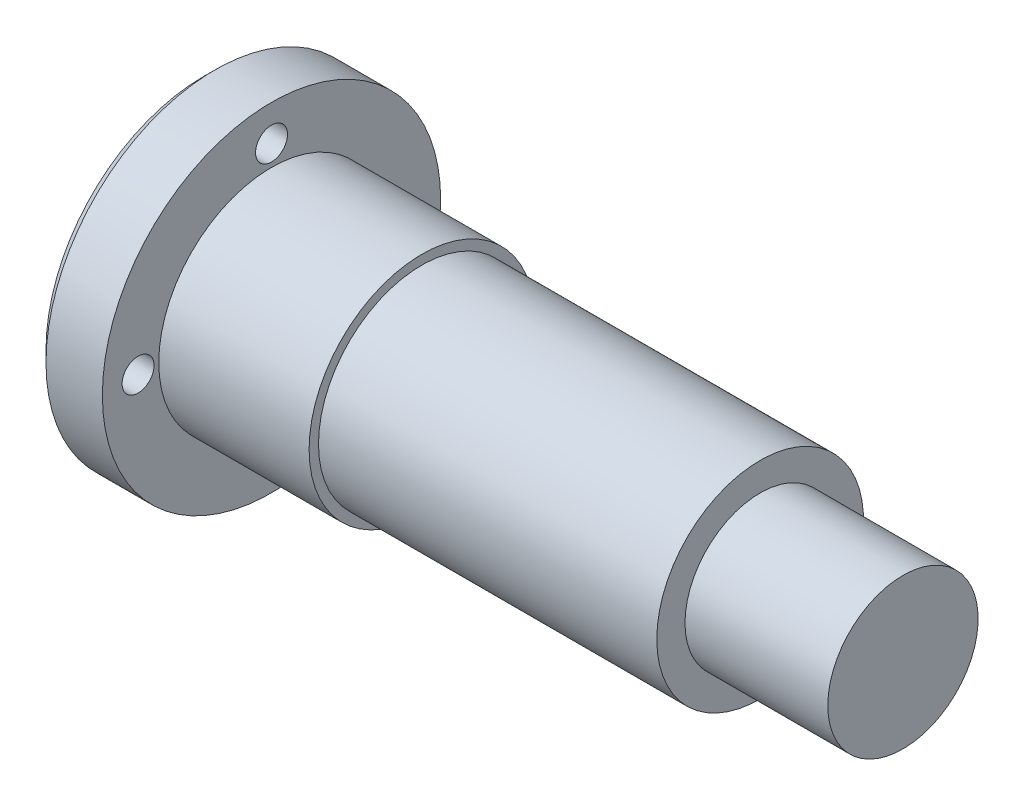
ISO-10303-21;
HEADER;
FILE_DESCRIPTION(('STEP AP214'),'2;1');
FILE_NAME('part.step','',(''),(''),'','','');
FILE_SCHEMA(('AUTOMOTIVE_DESIGN { 1 0 10303 214 1 1 1 1 }'));
ENDSEC;
DATA;
#1=APPLICATION_CONTEXT('core data for automotive mechanical design processes');
#2=APPLICATION_PROTOCOL_DEFINITION('international standard','automotive_design',2000,#1);
#3=PRODUCT_CONTEXT('',#1,'mechanical');
#4=PRODUCT('Part','Part','',(#3));
#5=PRODUCT_RELATED_PRODUCT_CATEGORY('part','',(#4));
#6=PRODUCT_DEFINITION_FORMATION('','',#4);
#7=PRODUCT_DEFINITION_CONTEXT('part definition',#1,'design');
#8=PRODUCT_DEFINITION('design','',#6,#7);
#9=PRODUCT_DEFINITION_SHAPE('','',#8);
#10=(LENGTH_UNIT() NAMED_UNIT(*) SI_UNIT(.MILLI.,.METRE.));
#11=(NAMED_UNIT(*) PLANE_ANGLE_UNIT() SI_UNIT($,.RADIAN.));
#12=(NAMED_UNIT(*) SI_UNIT($,.STERADIAN.) SOLID_ANGLE_UNIT());
#13=UNCERTAINTY_MEASURE_WITH_UNIT(LENGTH_MEASURE(1.E-05),#10,'distance_accuracy_value','');
#14=(GEOMETRIC_REPRESENTATION_CONTEXT(3) GLOBAL_UNCERTAINTY_ASSIGNED_CONTEXT((#13)) GLOBAL_UNIT_ASSIGNED_CONTEXT((#10,
#11,#12)) REPRESENTATION_CONTEXT('',''));
#15=CARTESIAN_POINT('',(0.,0.,0.));
#16=DIRECTION('',(0.,0.,1.));
#17=DIRECTION('',(1.,0.,0.));
#18=AXIS2_PLACEMENT_3D('',#15,#16,#17);
#19=CARTESIAN_POINT('',(189.,0.,0.));
#20=DIRECTION('',(-1.,0.,0.));
#21=DIRECTION('',(0.,0.,1.));
#22=AXIS2_PLACEMENT_3D('',#19,#20,#21);
#23=PLANE('',#22);
#24=CARTESIAN_POINT('',(189.,0.,0.));
#25=DIRECTION('',(-1.,0.,0.));
#26=DIRECTION('',(0.,0.,1.));
#27=AXIS2_PLACEMENT_3D('',#24,#25,#26);
#28=CIRCLE('',#27,20.);
#29=CARTESIAN_POINT('',(189.,0.,20.));
#30=VERTEX_POINT('',#29);
#31=EDGE_CURVE('E47',#30,#30,#28,.T.);
#32=ORIENTED_EDGE('',*,*,#31,.F.);
#33=EDGE_LOOP('',(#32));
#34=FACE_BOUND('',#33,.T.);
#35=ADVANCED_FACE('F35',(#34),#23,.F.);
#36=CARTESIAN_POINT('',(0.,0.,0.));
#37=DIRECTION('',(-1.,0.,0.));
#38=DIRECTION('',(0.,0.,1.));
#39=AXIS2_PLACEMENT_3D('',#36,#37,#38);
#40=CYLINDRICAL_SURFACE('',#39,20.);
#41=CARTESIAN_POINT('',(151.,0.,0.));
#42=DIRECTION('',(-1.,0.,0.));
#43=DIRECTION('',(0.,0.,1.));
#44=AXIS2_PLACEMENT_3D('',#41,#42,#43);
#45=CIRCLE('',#44,20.);
#46=CARTESIAN_POINT('',(151.,0.,20.));
#47=VERTEX_POINT('',#46);
#48=EDGE_CURVE('E51',#47,#47,#45,.T.);
#49=ORIENTED_EDGE('',*,*,#48,.F.);
#50=EDGE_LOOP('',(#49));
#51=FACE_BOUND('',#50,.T.);
#52=ORIENTED_EDGE('',*,*,#31,.T.);
#53=EDGE_LOOP('',(#52));
#54=FACE_BOUND('',#53,.T.);
#55=ADVANCED_FACE('F130',(#51,#54),#40,.T.);
#56=CARTESIAN_POINT('',(151.,20.,0.));
#57=DIRECTION('',(-1.,0.,0.));
#58=DIRECTION('',(0.,0.,1.));
#59=AXIS2_PLACEMENT_3D('',#56,#57,#58);
#60=PLANE('',#59);
#61=CARTESIAN_POINT('',(151.,0.,0.));
#62=DIRECTION('',(-1.,0.,0.));
#63=DIRECTION('',(0.,0.,1.));
#64=AXIS2_PLACEMENT_3D('',#61,#62,#63);
#65=CIRCLE('',#64,27.5);
#66=CARTESIAN_POINT('',(151.,0.,27.5));
#67=VERTEX_POINT('',#66);
#68=EDGE_CURVE('E56',#67,#67,#65,.T.);
#69=ORIENTED_EDGE('',*,*,#68,.F.);
#70=EDGE_LOOP('',(#69));
#71=FACE_BOUND('',#70,.T.);
#72=ORIENTED_EDGE('',*,*,#48,.T.);
#73=EDGE_LOOP('',(#72));
#74=FACE_BOUND('',#73,.T.);
#75=ADVANCED_FACE('F135',(#71,#74),#60,.F.);
#76=CARTESIAN_POINT('',(0.,0.,0.));
#77=DIRECTION('',(-1.,0.,0.));
#78=DIRECTION('',(0.,0.,1.));
#79=AXIS2_PLACEMENT_3D('',#76,#77,#78);
#80=CYLINDRICAL_SURFACE('',#79,27.5);
#81=CARTESIAN_POINT('',(61.,0.,0.));
#82=DIRECTION('',(-1.,0.,0.));
#83=DIRECTION('',(0.,0.,1.));
#84=AXIS2_PLACEMENT_3D('',#81,#82,#83);
#85=CIRCLE('',#84,27.5);
#86=CARTESIAN_POINT('',(61.,0.,27.5));
#87=VERTEX_POINT('',#86);
#88=EDGE_CURVE('E59',#87,#87,#85,.T.);
#89=ORIENTED_EDGE('',*,*,#88,.F.);
#90=EDGE_LOOP('',(#89));
#91=FACE_BOUND('',#90,.T.);
#92=ORIENTED_EDGE('',*,*,#68,.T.);
#93=EDGE_LOOP('',(#92));
#94=FACE_BOUND('',#93,.T.);
#95=ADVANCED_FACE('F142',(#91,#94),#80,.T.);
#96=CARTESIAN_POINT('',(61.,30.,0.));
#97=DIRECTION('',(-1.,0.,0.));
#98=DIRECTION('',(0.,0.,1.));
#99=AXIS2_PLACEMENT_3D('',#96,#97,#98);
#100=PLANE('',#99);
#101=CARTESIAN_POINT('',(61.,0.,0.));
#102=DIRECTION('',(-1.,0.,0.));
#103=DIRECTION('',(0.,0.,1.));
#104=AXIS2_PLACEMENT_3D('',#101,#102,#103);
#105=CIRCLE('',#104,30.);
#106=CARTESIAN_POINT('',(61.,0.,30.));
#107=VERTEX_POINT('',#106);
#108=EDGE_CURVE('E62',#107,#107,#105,.T.);
#109=ORIENTED_EDGE('',*,*,#108,.F.);
#110=EDGE_LOOP('',(#109));
#111=FACE_BOUND('',#110,.T.);
#112=ORIENTED_EDGE('',*,*,#88,.T.);
#113=EDGE_LOOP('',(#112));
#114=FACE_BOUND('',#113,.T.);
#115=ADVANCED_FACE('F146',(#111,#114),#100,.F.);
#116=CARTESIAN_POINT('',(0.,0.,0.));
#117=DIRECTION('',(-1.,0.,0.));
#118=DIRECTION('',(0.,0.,1.));
#119=AXIS2_PLACEMENT_3D('',#116,#117,#118);
#120=CYLINDRICAL_SURFACE('',#119,30.);
#121=CARTESIAN_POINT('',(21.,0.,0.));
#122=DIRECTION('',(-1.,0.,0.));
#123=DIRECTION('',(0.,0.,1.));
#124=AXIS2_PLACEMENT_3D('',#121,#122,#123);
#125=CIRCLE('',#124,30.);
#126=CARTESIAN_POINT('',(21.,0.,30.));
#127=VERTEX_POINT('',#126);
#128=EDGE_CURVE('E65',#127,#127,#125,.T.);
#129=ORIENTED_EDGE('',*,*,#128,.F.);
#130=EDGE_LOOP('',(#129));
#131=FACE_BOUND('',#130,.T.);
#132=ORIENTED_EDGE('',*,*,#108,.T.);
#133=EDGE_LOOP('',(#132));
#134=FACE_BOUND('',#133,.T.);
#135=ADVANCED_FACE('F150',(#131,#134),#120,.T.);
#136=CARTESIAN_POINT('',(21.,30.,0.));
#137=DIRECTION('',(-1.,0.,0.));
#138=DIRECTION('',(0.,0.,1.));
#139=AXIS2_PLACEMENT_3D('',#136,#137,#138);
#140=PLANE('',#139);
#141=CARTESIAN_POINT('',(21.,0.,35.5));
#142=DIRECTION('',(-1.,0.,0.));
#143=DIRECTION('',(0.,0.,1.));
#144=AXIS2_PLACEMENT_3D('',#141,#142,#143);
#145=CIRCLE('',#144,4.25000000000001);
#146=CARTESIAN_POINT('',(21.,0.,39.75));
#147=VERTEX_POINT('',#146);
#148=EDGE_CURVE('E77',#147,#147,#145,.F.);
#149=ORIENTED_EDGE('',*,*,#148,.F.);
#150=EDGE_LOOP('',(#149));
#151=FACE_BOUND('',#150,.T.);
#152=CARTESIAN_POINT('',(21.,-35.5,0.));
#153=DIRECTION('',(-1.,0.,0.));
#154=DIRECTION('',(0.,0.,1.));
#155=AXIS2_PLACEMENT_3D('',#152,#153,#154);
#156=CIRCLE('',#155,4.25);
#157=CARTESIAN_POINT('',(21.,-35.5,4.25));
#158=VERTEX_POINT('',#157);
#159=EDGE_CURVE('E91',#158,#158,#156,.F.);
#160=ORIENTED_EDGE('',*,*,#159,.F.);
#161=EDGE_LOOP('',(#160));
#162=FACE_BOUND('',#161,.T.);
#163=CARTESIAN_POINT('',(21.,0.,-35.5));
#164=DIRECTION('',(-1.,0.,0.));
#165=DIRECTION('',(0.,0.,1.));
#166=AXIS2_PLACEMENT_3D('',#163,#164,#165);
#167=CIRCLE('',#166,4.25000000000001);
#168=CARTESIAN_POINT('',(21.,0.,-31.25));
#169=VERTEX_POINT('',#168);
#170=EDGE_CURVE('E85',#169,#169,#167,.F.);
#171=ORIENTED_EDGE('',*,*,#170,.F.);
#172=EDGE_LOOP('',(#171));
#173=FACE_BOUND('',#172,.T.);
#174=CARTESIAN_POINT('',(21.,35.5,0.));
#175=DIRECTION('',(-1.,0.,0.));
#176=DIRECTION('',(0.,0.,1.));
#177=AXIS2_PLACEMENT_3D('',#174,#175,#176);
#178=CIRCLE('',#177,4.25);
#179=CARTESIAN_POINT('',(21.,35.5,4.24999999999999));
#180=VERTEX_POINT('',#179);
#181=EDGE_CURVE('E78',#180,#180,#178,.F.);
#182=ORIENTED_EDGE('',*,*,#181,.F.);
#183=EDGE_LOOP('',(#182));
#184=FACE_BOUND('',#183,.T.);
#185=CARTESIAN_POINT('',(21.,0.,0.));
#186=DIRECTION('',(-1.,0.,0.));
#187=DIRECTION('',(0.,0.,1.));
#188=AXIS2_PLACEMENT_3D('',#185,#186,#187);
#189=CIRCLE('',#188,45.);
#190=CARTESIAN_POINT('',(21.,0.,45.));
#191=VERTEX_POINT('',#190);
#192=EDGE_CURVE('E68',#191,#191,#189,.T.);
#193=ORIENTED_EDGE('',*,*,#192,.F.);
#194=EDGE_LOOP('',(#193));
#195=FACE_BOUND('',#194,.T.);
#196=ORIENTED_EDGE('',*,*,#128,.T.);
#197=EDGE_LOOP('',(#196));
#198=FACE_BOUND('',#197,.T.);
#199=ADVANCED_FACE('F154',(#151,#162,#173,#184,#195,#198),#140,.F.);
#200=CARTESIAN_POINT('',(0.,0.,0.));
#201=DIRECTION('',(-1.,0.,0.));
#202=DIRECTION('',(0.,0.,1.));
#203=AXIS2_PLACEMENT_3D('',#200,#201,#202);
#204=CYLINDRICAL_SURFACE('',#203,45.);
#205=CARTESIAN_POINT('',(6.00000000000002,0.,0.));
#206=DIRECTION('',(1.,0.,0.));
#207=DIRECTION('',(0.,0.,-1.));
#208=AXIS2_PLACEMENT_3D('',#205,#206,#207);
#209=CIRCLE('',#208,45.);
#210=CARTESIAN_POINT('',(6.00000000000002,0.,-45.));
#211=VERTEX_POINT('',#210);
#212=EDGE_CURVE('E10',#211,#211,#209,.T.);
#213=ORIENTED_EDGE('',*,*,#212,.T.);
#214=EDGE_LOOP('',(#213));
#215=FACE_BOUND('',#214,.T.);
#216=ORIENTED_EDGE('',*,*,#192,.T.);
#217=EDGE_LOOP('',(#216));
#218=FACE_BOUND('',#217,.T.);
#219=ADVANCED_FACE('F109',(#215,#218),#204,.T.);
#220=CARTESIAN_POINT('',(3.,45.,0.));
#221=DIRECTION('',(1.,0.,0.));
#222=DIRECTION('',(0.,0.,-1.));
#223=AXIS2_PLACEMENT_3D('',#220,#221,#222);
#224=PLANE('',#223);
#225=CARTESIAN_POINT('',(3.,0.,35.5));
#226=DIRECTION('',(-1.,0.,0.));
#227=DIRECTION('',(0.,0.,1.));
#228=AXIS2_PLACEMENT_3D('',#225,#226,#227);
#229=CIRCLE('',#228,4.25000000000001);
#230=CARTESIAN_POINT('',(3.,0.,39.75));
#231=VERTEX_POINT('',#230);
#232=EDGE_CURVE('E94',#231,#231,#229,.T.);
#233=ORIENTED_EDGE('',*,*,#232,.F.);
#234=EDGE_LOOP('',(#233));
#235=FACE_BOUND('',#234,.T.);
#236=CARTESIAN_POINT('',(3.,-35.5,0.));
#237=DIRECTION('',(-1.,0.,0.));
#238=DIRECTION('',(0.,0.,1.));
#239=AXIS2_PLACEMENT_3D('',#236,#237,#238);
#240=CIRCLE('',#239,4.25);
#241=CARTESIAN_POINT('',(3.,-35.5,4.25));
#242=VERTEX_POINT('',#241);
#243=EDGE_CURVE('E88',#242,#242,#240,.T.);
#244=ORIENTED_EDGE('',*,*,#243,.F.);
#245=EDGE_LOOP('',(#244));
#246=FACE_BOUND('',#245,.T.);
#247=CARTESIAN_POINT('',(3.,0.,-35.5));
#248=DIRECTION('',(-1.,0.,0.));
#249=DIRECTION('',(0.,0.,1.));
#250=AXIS2_PLACEMENT_3D('',#247,#248,#249);
#251=CIRCLE('',#250,4.25000000000001);
#252=CARTESIAN_POINT('',(3.,0.,-31.25));
#253=VERTEX_POINT('',#252);
#254=EDGE_CURVE('E81',#253,#253,#251,.T.);
#255=ORIENTED_EDGE('',*,*,#254,.F.);
#256=EDGE_LOOP('',(#255));
#257=FACE_BOUND('',#256,.T.);
#258=CARTESIAN_POINT('',(3.,35.5,0.));
#259=DIRECTION('',(-1.,0.,0.));
#260=DIRECTION('',(0.,0.,1.));
#261=AXIS2_PLACEMENT_3D('',#258,#259,#260);
#262=CIRCLE('',#261,4.25);
#263=CARTESIAN_POINT('',(3.,35.5,4.24999999999999));
#264=VERTEX_POINT('',#263);
#265=EDGE_CURVE('E82',#264,#264,#262,.T.);
#266=ORIENTED_EDGE('',*,*,#265,.F.);
#267=EDGE_LOOP('',(#266));
#268=FACE_BOUND('',#267,.T.);
#269=CARTESIAN_POINT('',(3.,0.,0.));
#270=DIRECTION('',(1.,0.,0.));
#271=DIRECTION('',(0.,0.,-1.));
#272=AXIS2_PLACEMENT_3D('',#269,#270,#271);
#273=CIRCLE('',#272,42.);
#274=CARTESIAN_POINT('',(3.,0.,-42.));
#275=VERTEX_POINT('',#274);
#276=EDGE_CURVE('E43',#275,#275,#273,.F.);
#277=ORIENTED_EDGE('',*,*,#276,.T.);
#278=EDGE_LOOP('',(#277));
#279=FACE_BOUND('',#278,.T.);
#280=CARTESIAN_POINT('',(3.,0.,0.));
#281=DIRECTION('',(-1.,0.,0.));
#282=DIRECTION('',(0.,0.,1.));
#283=AXIS2_PLACEMENT_3D('',#280,#281,#282);
#284=CIRCLE('',#283,28.);
#285=CARTESIAN_POINT('',(3.,0.,28.));
#286=VERTEX_POINT('',#285);
#287=EDGE_CURVE('E71',#286,#286,#284,.T.);
#288=ORIENTED_EDGE('',*,*,#287,.F.);
#289=EDGE_LOOP('',(#288));
#290=FACE_BOUND('',#289,.T.);
#291=ADVANCED_FACE('F105',(#235,#246,#257,#268,#279,#290),#224,.F.);
#292=CARTESIAN_POINT('',(3.,0.,0.));
#293=DIRECTION('',(1.,0.,0.));
#294=DIRECTION('',(0.,0.,-1.));
#295=AXIS2_PLACEMENT_3D('',#292,#293,#294);
#296=CONICAL_SURFACE('',#295,28.,0.785398163397447);
#297=CARTESIAN_POINT('',(0.,0.,0.));
#298=DIRECTION('',(-1.,0.,0.));
#299=DIRECTION('',(0.,0.,1.));
#300=AXIS2_PLACEMENT_3D('',#297,#298,#299);
#301=CIRCLE('',#300,25.);
#302=CARTESIAN_POINT('',(0.,0.,25.));
#303=VERTEX_POINT('',#302);
#304=EDGE_CURVE('E74',#303,#303,#301,.T.);
#305=ORIENTED_EDGE('',*,*,#304,.F.);
#306=EDGE_LOOP('',(#305));
#307=FACE_BOUND('',#306,.T.);
#308=ORIENTED_EDGE('',*,*,#287,.T.);
#309=EDGE_LOOP('',(#308));
#310=FACE_BOUND('',#309,.T.);
#311=ADVANCED_FACE('F108',(#307,#310),#296,.T.);
#312=CARTESIAN_POINT('',(0.,0.,0.));
#313=DIRECTION('',(1.,0.,0.));
#314=DIRECTION('',(0.,0.,-1.));
#315=AXIS2_PLACEMENT_3D('',#312,#313,#314);
#316=PLANE('',#315);
#317=ORIENTED_EDGE('',*,*,#304,.T.);
#318=EDGE_LOOP('',(#317));
#319=FACE_BOUND('',#318,.T.);
#320=ADVANCED_FACE('F120',(#319),#316,.F.);
#321=CARTESIAN_POINT('',(3.,0.,0.));
#322=DIRECTION('',(1.,0.,0.));
#323=DIRECTION('',(0.,0.,-1.));
#324=AXIS2_PLACEMENT_3D('',#321,#322,#323);
#325=CONICAL_SURFACE('',#324,42.,0.785398163397441);
#326=CARTESIAN_POINT('',(6.00000000000002,0.,-45.));
#327=CARTESIAN_POINT('',(5.96875000000002,0.,-44.96875));
#328=CARTESIAN_POINT('',(5.93750000000002,0.,-44.9375));
#329=CARTESIAN_POINT('',(5.87500000000002,0.,-44.875));
#330=CARTESIAN_POINT('',(5.84375000000002,0.,-44.84375));
#331=CARTESIAN_POINT('',(5.78125000000002,0.,-44.78125));
#332=CARTESIAN_POINT('',(5.75000000000002,0.,-44.75));
#333=CARTESIAN_POINT('',(5.68750000000002,0.,-44.6875));
#334=CARTESIAN_POINT('',(5.65625000000002,0.,-44.65625));
#335=CARTESIAN_POINT('',(5.59375000000002,0.,-44.59375));
#336=CARTESIAN_POINT('',(5.56250000000002,0.,-44.5625));
#337=CARTESIAN_POINT('',(5.50000000000002,0.,-44.5));
#338=CARTESIAN_POINT('',(5.46875000000002,0.,-44.46875));
#339=CARTESIAN_POINT('',(5.40625000000002,0.,-44.40625));
#340=CARTESIAN_POINT('',(5.37500000000002,0.,-44.375));
#341=CARTESIAN_POINT('',(5.31250000000002,0.,-44.3125));
#342=CARTESIAN_POINT('',(5.28125000000002,0.,-44.28125));
#343=CARTESIAN_POINT('',(5.21875000000002,0.,-44.21875));
#344=CARTESIAN_POINT('',(5.18750000000002,0.,-44.1875));
#345=CARTESIAN_POINT('',(5.12500000000002,0.,-44.125));
#346=CARTESIAN_POINT('',(5.09375000000002,0.,-44.09375));
#347=CARTESIAN_POINT('',(5.03125000000002,0.,-44.03125));
#348=CARTESIAN_POINT('',(5.00000000000002,0.,-44.));
#349=CARTESIAN_POINT('',(4.93750000000002,0.,-43.9375));
#350=CARTESIAN_POINT('',(4.90625000000002,0.,-43.90625));
#351=CARTESIAN_POINT('',(4.84375000000002,0.,-43.84375));
#352=CARTESIAN_POINT('',(4.81250000000002,0.,-43.8125));
#353=CARTESIAN_POINT('',(4.75000000000001,0.,-43.75));
#354=CARTESIAN_POINT('',(4.71875000000001,0.,-43.71875));
#355=CARTESIAN_POINT('',(4.65625000000001,0.,-43.65625));
#356=CARTESIAN_POINT('',(4.62500000000001,0.,-43.625));
#357=CARTESIAN_POINT('',(4.56250000000001,0.,-43.5625));
#358=CARTESIAN_POINT('',(4.53125000000001,0.,-43.53125));
#359=CARTESIAN_POINT('',(4.46875000000001,0.,-43.46875));
#360=CARTESIAN_POINT('',(4.43750000000001,0.,-43.4375));
#361=CARTESIAN_POINT('',(4.37500000000001,0.,-43.375));
#362=CARTESIAN_POINT('',(4.34375000000001,0.,-43.34375));
#363=CARTESIAN_POINT('',(4.28125000000001,0.,-43.28125));
#364=CARTESIAN_POINT('',(4.25000000000001,0.,-43.25));
#365=CARTESIAN_POINT('',(4.18750000000001,0.,-43.1875));
#366=CARTESIAN_POINT('',(4.15625000000001,0.,-43.15625));
#367=CARTESIAN_POINT('',(4.09375000000001,0.,-43.09375));
#368=CARTESIAN_POINT('',(4.06250000000001,0.,-43.0625));
#369=CARTESIAN_POINT('',(4.00000000000001,0.,-43.));
#370=CARTESIAN_POINT('',(3.96875000000001,0.,-42.96875));
#371=CARTESIAN_POINT('',(3.90625000000001,0.,-42.90625));
#372=CARTESIAN_POINT('',(3.87500000000001,0.,-42.875));
#373=CARTESIAN_POINT('',(3.81250000000001,0.,-42.8125));
#374=CARTESIAN_POINT('',(3.78125000000001,0.,-42.78125));
#375=CARTESIAN_POINT('',(3.71875000000001,0.,-42.71875));
#376=CARTESIAN_POINT('',(3.68750000000001,0.,-42.6875));
#377=CARTESIAN_POINT('',(3.625,0.,-42.625));
#378=CARTESIAN_POINT('',(3.59375000000001,0.,-42.59375));
#379=CARTESIAN_POINT('',(3.53125000000001,0.,-42.53125));
#380=CARTESIAN_POINT('',(3.50000000000001,0.,-42.5));
#381=CARTESIAN_POINT('',(3.4375,0.,-42.4375));
#382=CARTESIAN_POINT('',(3.40625,0.,-42.40625));
#383=CARTESIAN_POINT('',(3.34375,0.,-42.34375));
#384=CARTESIAN_POINT('',(3.3125,0.,-42.3125));
#385=CARTESIAN_POINT('',(3.25,0.,-42.25));
#386=CARTESIAN_POINT('',(3.21875,0.,-42.21875));
#387=CARTESIAN_POINT('',(3.15625,0.,-42.15625));
#388=CARTESIAN_POINT('',(3.125,0.,-42.125));
#389=CARTESIAN_POINT('',(3.0625,0.,-42.0625));
#390=CARTESIAN_POINT('',(3.03125,0.,-42.03125));
#391=CARTESIAN_POINT('',(3.,0.,-42.));
#392=B_SPLINE_CURVE_WITH_KNOTS('',3,(#326,#327,#328,#329,#330,#331,#332,#333,#334,#335,#336,
#337,#338,#339,#340,#341,#342,#343,#344,#345,#346,#347,#348,#349,#350,#351,#352,#353,#354,#355,
#356,#357,#358,#359,#360,#361,#362,#363,#364,#365,#366,#367,#368,#369,#370,#371,#372,#373,#374,
#375,#376,#377,#378,#379,#380,#381,#382,#383,#384,#385,#386,#387,#388,#389,#390,#391),
.UNSPECIFIED.,.F.,.F.,(4,2,2,2,2,2,2,2,2,2,2,2,2,2,2,2,2,2,2,2,2,2,2,2,2,2,2,2,2,2,2,2,4),(0.,
0.132582521472477,0.265165042944957,0.397747564417432,0.530330085889913,0.662912607362389,
0.795495128834865,0.928077650307346,1.06066017177982,1.1932426932523,1.32582521472478,
1.45840773619725,1.59099025766973,1.72357277914221,1.85615530061469,1.98873782208717,
2.12132034355964,2.25390286503212,2.3864853865046,2.51906790797708,2.65165042944955,
2.78423295092204,2.91681547239451,3.04939799386699,3.18198051533947,3.31456303681194,
3.44714555828442,3.5797280797569,3.71231060122938,3.84489312270186,3.97747564417433,
4.11005816564681,4.24264068711929),.UNSPECIFIED.);
#393=EDGE_CURVE('BSEAM38',#211,#275,#392,.T.);
#394=ORIENTED_EDGE('',*,*,#212,.F.);
#395=ORIENTED_EDGE('',*,*,#276,.F.);
#396=ORIENTED_EDGE('',*,*,#393,.T.);
#397=ORIENTED_EDGE('',*,*,#393,.F.);
#398=EDGE_LOOP('',(#394,#396,#395,#397));
#399=FACE_BOUND('',#398,.T.);
#400=ADVANCED_FACE('F38',(#399),#325,.T.);
#401=CARTESIAN_POINT('',(189.001,35.5,0.));
#402=DIRECTION('',(-1.,0.,0.));
#403=DIRECTION('',(0.,0.,1.));
#404=AXIS2_PLACEMENT_3D('',#401,#402,#403);
#405=CYLINDRICAL_SURFACE('',#404,4.25);
#406=ORIENTED_EDGE('',*,*,#265,.T.);
#407=EDGE_LOOP('',(#406));
#408=FACE_BOUND('',#407,.T.);
#409=ORIENTED_EDGE('',*,*,#181,.T.);
#410=EDGE_LOOP('',(#409));
#411=FACE_BOUND('',#410,.T.);
#412=ADVANCED_FACE('F192',(#408,#411),#405,.F.);
#413=CARTESIAN_POINT('',(189.001,0.,-35.5));
#414=DIRECTION('',(-1.,0.,0.));
#415=DIRECTION('',(0.,0.,1.));
#416=AXIS2_PLACEMENT_3D('',#413,#414,#415);
#417=CYLINDRICAL_SURFACE('',#416,4.25000000000001);
#418=ORIENTED_EDGE('',*,*,#254,.T.);
#419=EDGE_LOOP('',(#418));
#420=FACE_BOUND('',#419,.T.);
#421=ORIENTED_EDGE('',*,*,#170,.T.);
#422=EDGE_LOOP('',(#421));
#423=FACE_BOUND('',#422,.T.);
#424=ADVANCED_FACE('F197',(#420,#423),#417,.F.);
#425=CARTESIAN_POINT('',(189.001,-35.5,0.));
#426=DIRECTION('',(-1.,0.,0.));
#427=DIRECTION('',(0.,0.,1.));
#428=AXIS2_PLACEMENT_3D('',#425,#426,#427);
#429=CYLINDRICAL_SURFACE('',#428,4.25);
#430=ORIENTED_EDGE('',*,*,#243,.T.);
#431=EDGE_LOOP('',(#430));
#432=FACE_BOUND('',#431,.T.);
#433=ORIENTED_EDGE('',*,*,#159,.T.);
#434=EDGE_LOOP('',(#433));
#435=FACE_BOUND('',#434,.T.);
#436=ADVANCED_FACE('F209',(#432,#435),#429,.F.);
#437=CARTESIAN_POINT('',(189.001,0.,35.5));
#438=DIRECTION('',(-1.,0.,0.));
#439=DIRECTION('',(0.,0.,1.));
#440=AXIS2_PLACEMENT_3D('',#437,#438,#439);
#441=CYLINDRICAL_SURFACE('',#440,4.25000000000001);
#442=ORIENTED_EDGE('',*,*,#232,.T.);
#443=EDGE_LOOP('',(#442));
#444=FACE_BOUND('',#443,.T.);
#445=ORIENTED_EDGE('',*,*,#148,.T.);
#446=EDGE_LOOP('',(#445));
#447=FACE_BOUND('',#446,.T.);
#448=ADVANCED_FACE('F102',(#444,#447),#441,.F.);
#449=CLOSED_SHELL('',(#35,#55,#75,#95,#115,#135,#199,#219,#291,#311,#320,#400,#412,#424,#436,#448));
#450=MANIFOLD_SOLID_BREP('B2',#449);
#451=ADVANCED_BREP_SHAPE_REPRESENTATION('',(#18,#450),#14);
#452=SHAPE_DEFINITION_REPRESENTATION(#9,#451);
ENDSEC;
END-ISO-10303-21;
